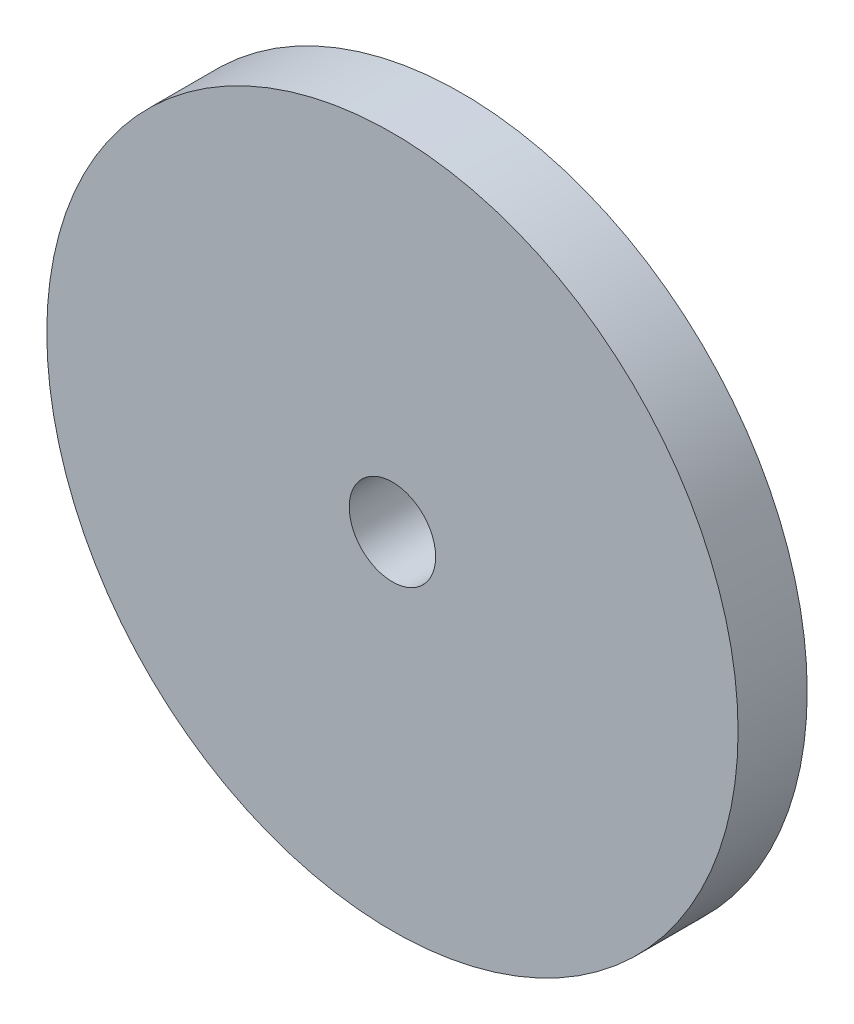
ISO-10303-21;
HEADER;
FILE_DESCRIPTION(('STEP AP214'),'2;1');
FILE_NAME('part.step','',(''),(''),'','','');
FILE_SCHEMA(('AUTOMOTIVE_DESIGN { 1 0 10303 214 1 1 1 1 }'));
ENDSEC;
DATA;
#1=APPLICATION_CONTEXT('core data for automotive mechanical design processes');
#2=APPLICATION_PROTOCOL_DEFINITION('international standard','automotive_design',2000,#1);
#3=PRODUCT_CONTEXT('',#1,'mechanical');
#4=PRODUCT('Part','Part','',(#3));
#5=PRODUCT_RELATED_PRODUCT_CATEGORY('part','',(#4));
#6=PRODUCT_DEFINITION_FORMATION('','',#4);
#7=PRODUCT_DEFINITION_CONTEXT('part definition',#1,'design');
#8=PRODUCT_DEFINITION('design','',#6,#7);
#9=PRODUCT_DEFINITION_SHAPE('','',#8);
#10=(LENGTH_UNIT() NAMED_UNIT(*) SI_UNIT(.MILLI.,.METRE.));
#11=(NAMED_UNIT(*) PLANE_ANGLE_UNIT() SI_UNIT($,.RADIAN.));
#12=(NAMED_UNIT(*) SI_UNIT($,.STERADIAN.) SOLID_ANGLE_UNIT());
#13=UNCERTAINTY_MEASURE_WITH_UNIT(LENGTH_MEASURE(1.E-05),#10,'distance_accuracy_value','');
#14=(GEOMETRIC_REPRESENTATION_CONTEXT(3) GLOBAL_UNCERTAINTY_ASSIGNED_CONTEXT((#13)) GLOBAL_UNIT_ASSIGNED_CONTEXT((#10,
#11,#12)) REPRESENTATION_CONTEXT('',''));
#15=CARTESIAN_POINT('',(0.,0.,0.));
#16=DIRECTION('',(0.,0.,1.));
#17=DIRECTION('',(1.,0.,0.));
#18=AXIS2_PLACEMENT_3D('',#15,#16,#17);
#19=CARTESIAN_POINT('',(0.,0.,4.));
#20=DIRECTION('',(0.,0.,1.));
#21=DIRECTION('',(1.,0.,0.));
#22=AXIS2_PLACEMENT_3D('',#19,#20,#21);
#23=PLANE('',#22);
#24=CARTESIAN_POINT('',(0.,0.,4.));
#25=DIRECTION('',(0.,0.,1.));
#26=DIRECTION('',(1.,0.,0.));
#27=AXIS2_PLACEMENT_3D('',#24,#25,#26);
#28=CIRCLE('',#27,20.);
#29=CARTESIAN_POINT('',(20.,0.,4.));
#30=VERTEX_POINT('',#29);
#31=EDGE_CURVE('E10',#30,#30,#28,.T.);
#32=ORIENTED_EDGE('',*,*,#31,.T.);
#33=EDGE_LOOP('',(#32));
#34=FACE_BOUND('',#33,.T.);
#35=CARTESIAN_POINT('',(0.,0.,4.));
#36=DIRECTION('',(0.,0.,1.));
#37=DIRECTION('',(1.,0.,0.));
#38=AXIS2_PLACEMENT_3D('',#35,#36,#37);
#39=CIRCLE('',#38,2.5);
#40=CARTESIAN_POINT('',(2.5,0.,4.));
#41=VERTEX_POINT('',#40);
#42=EDGE_CURVE('E48',#41,#41,#39,.T.);
#43=ORIENTED_EDGE('',*,*,#42,.F.);
#44=EDGE_LOOP('',(#43));
#45=FACE_BOUND('',#44,.T.);
#46=ADVANCED_FACE('F37',(#34,#45),#23,.T.);
#47=CARTESIAN_POINT('',(0.,0.,0.));
#48=DIRECTION('',(0.,0.,1.));
#49=DIRECTION('',(1.,0.,0.));
#50=AXIS2_PLACEMENT_3D('',#47,#48,#49);
#51=PLANE('',#50);
#52=CARTESIAN_POINT('',(0.,0.,0.));
#53=DIRECTION('',(0.,0.,1.));
#54=DIRECTION('',(1.,0.,0.));
#55=AXIS2_PLACEMENT_3D('',#52,#53,#54);
#56=CIRCLE('',#55,20.);
#57=CARTESIAN_POINT('',(20.,0.,0.));
#58=VERTEX_POINT('',#57);
#59=EDGE_CURVE('E41',#58,#58,#56,.T.);
#60=ORIENTED_EDGE('',*,*,#59,.F.);
#61=EDGE_LOOP('',(#60));
#62=FACE_BOUND('',#61,.T.);
#63=CARTESIAN_POINT('',(0.,0.,0.));
#64=DIRECTION('',(0.,0.,1.));
#65=DIRECTION('',(1.,0.,0.));
#66=AXIS2_PLACEMENT_3D('',#63,#64,#65);
#67=CIRCLE('',#66,2.5);
#68=CARTESIAN_POINT('',(2.5,0.,0.));
#69=VERTEX_POINT('',#68);
#70=EDGE_CURVE('E50',#69,#69,#67,.T.);
#71=ORIENTED_EDGE('',*,*,#70,.T.);
#72=EDGE_LOOP('',(#71));
#73=FACE_BOUND('',#72,.T.);
#74=ADVANCED_FACE('F60',(#62,#73),#51,.F.);
#75=CARTESIAN_POINT('',(0.,0.,4.));
#76=DIRECTION('',(0.,0.,-1.));
#77=DIRECTION('',(-1.,0.,0.));
#78=AXIS2_PLACEMENT_3D('',#75,#76,#77);
#79=CYLINDRICAL_SURFACE('',#78,20.);
#80=ORIENTED_EDGE('',*,*,#31,.F.);
#81=EDGE_LOOP('',(#80));
#82=FACE_BOUND('',#81,.T.);
#83=ORIENTED_EDGE('',*,*,#59,.T.);
#84=EDGE_LOOP('',(#83));
#85=FACE_BOUND('',#84,.T.);
#86=ADVANCED_FACE('F39',(#82,#85),#79,.T.);
#87=CARTESIAN_POINT('',(0.,0.,4.));
#88=DIRECTION('',(0.,0.,-1.));
#89=DIRECTION('',(-1.,0.,0.));
#90=AXIS2_PLACEMENT_3D('',#87,#88,#89);
#91=CYLINDRICAL_SURFACE('',#90,2.5);
#92=ORIENTED_EDGE('',*,*,#42,.T.);
#93=EDGE_LOOP('',(#92));
#94=FACE_BOUND('',#93,.T.);
#95=ORIENTED_EDGE('',*,*,#70,.F.);
#96=EDGE_LOOP('',(#95));
#97=FACE_BOUND('',#96,.T.);
#98=ADVANCED_FACE('F56',(#94,#97),#91,.F.);
#99=CLOSED_SHELL('',(#46,#74,#86,#98));
#100=MANIFOLD_SOLID_BREP('B2',#99);
#101=ADVANCED_BREP_SHAPE_REPRESENTATION('',(#18,#100),#14);
#102=SHAPE_DEFINITION_REPRESENTATION(#9,#101);
ENDSEC;
END-ISO-10303-21;
